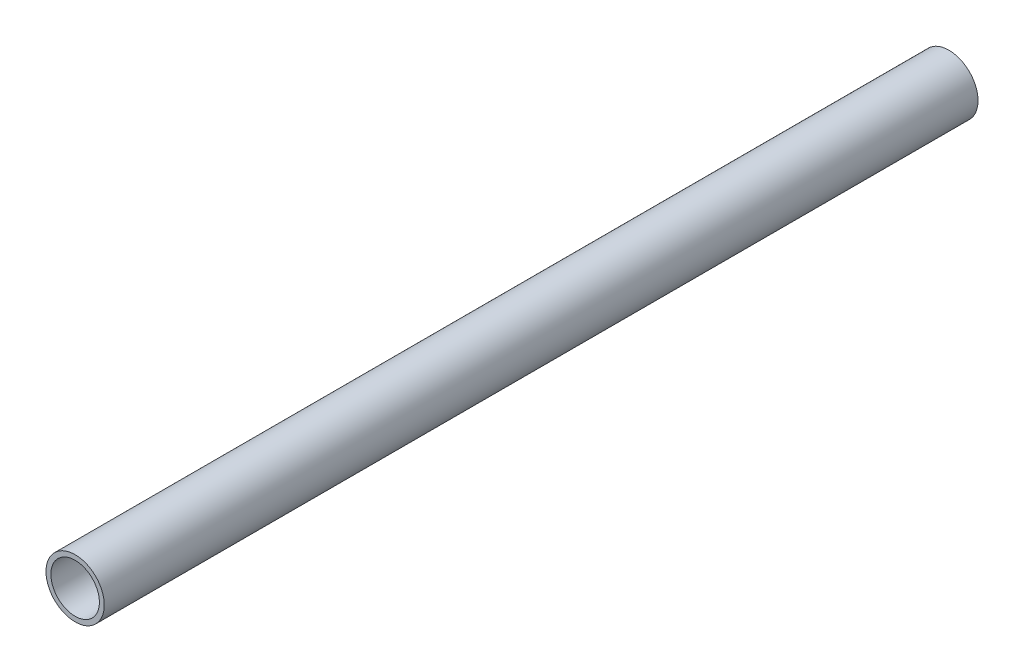
ISO-10303-21;
HEADER;
FILE_DESCRIPTION(('STEP AP214'),'2;1');
FILE_NAME('part.step','',(''),(''),'','','');
FILE_SCHEMA(('AUTOMOTIVE_DESIGN { 1 0 10303 214 1 1 1 1 }'));
ENDSEC;
DATA;
#1=APPLICATION_CONTEXT('core data for automotive mechanical design processes');
#2=APPLICATION_PROTOCOL_DEFINITION('international standard','automotive_design',2000,#1);
#3=PRODUCT_CONTEXT('',#1,'mechanical');
#4=PRODUCT('Part','Part','',(#3));
#5=PRODUCT_RELATED_PRODUCT_CATEGORY('part','',(#4));
#6=PRODUCT_DEFINITION_FORMATION('','',#4);
#7=PRODUCT_DEFINITION_CONTEXT('part definition',#1,'design');
#8=PRODUCT_DEFINITION('design','',#6,#7);
#9=PRODUCT_DEFINITION_SHAPE('','',#8);
#10=(LENGTH_UNIT() NAMED_UNIT(*) SI_UNIT(.MILLI.,.METRE.));
#11=(NAMED_UNIT(*) PLANE_ANGLE_UNIT() SI_UNIT($,.RADIAN.));
#12=(NAMED_UNIT(*) SI_UNIT($,.STERADIAN.) SOLID_ANGLE_UNIT());
#13=UNCERTAINTY_MEASURE_WITH_UNIT(LENGTH_MEASURE(1.E-05),#10,'distance_accuracy_value','');
#14=(GEOMETRIC_REPRESENTATION_CONTEXT(3) GLOBAL_UNCERTAINTY_ASSIGNED_CONTEXT((#13)) GLOBAL_UNIT_ASSIGNED_CONTEXT((#10,
#11,#12)) REPRESENTATION_CONTEXT('',''));
#15=CARTESIAN_POINT('',(0.,0.,0.));
#16=DIRECTION('',(0.,0.,1.));
#17=DIRECTION('',(1.,0.,0.));
#18=AXIS2_PLACEMENT_3D('',#15,#16,#17);
#19=CARTESIAN_POINT('',(0.,0.,90.));
#20=DIRECTION('',(0.,0.,1.));
#21=DIRECTION('',(1.,0.,0.));
#22=AXIS2_PLACEMENT_3D('',#19,#20,#21);
#23=PLANE('',#22);
#24=CARTESIAN_POINT('',(0.,0.,90.));
#25=DIRECTION('',(0.,0.,1.));
#26=DIRECTION('',(1.,0.,0.));
#27=AXIS2_PLACEMENT_3D('',#24,#25,#26);
#28=CIRCLE('',#27,6.);
#29=CARTESIAN_POINT('',(-6.,0.,90.));
#30=VERTEX_POINT('',#29);
#31=EDGE_CURVE('E10',#30,#30,#28,.T.);
#32=ORIENTED_EDGE('',*,*,#31,.T.);
#33=EDGE_LOOP('',(#32));
#34=FACE_BOUND('',#33,.T.);
#35=CARTESIAN_POINT('',(0.,0.,90.));
#36=DIRECTION('',(0.,0.,1.));
#37=DIRECTION('',(1.,0.,0.));
#38=AXIS2_PLACEMENT_3D('',#35,#36,#37);
#39=CIRCLE('',#38,5.);
#40=CARTESIAN_POINT('',(-5.,0.,90.));
#41=VERTEX_POINT('',#40);
#42=EDGE_CURVE('E42',#41,#41,#39,.T.);
#43=ORIENTED_EDGE('',*,*,#42,.F.);
#44=EDGE_LOOP('',(#43));
#45=FACE_BOUND('',#44,.T.);
#46=ADVANCED_FACE('F31',(#34,#45),#23,.T.);
#47=CARTESIAN_POINT('',(0.,0.,-90.));
#48=DIRECTION('',(0.,0.,1.));
#49=DIRECTION('',(1.,0.,0.));
#50=AXIS2_PLACEMENT_3D('',#47,#48,#49);
#51=PLANE('',#50);
#52=CARTESIAN_POINT('',(0.,0.,-90.));
#53=DIRECTION('',(0.,0.,1.));
#54=DIRECTION('',(1.,0.,0.));
#55=AXIS2_PLACEMENT_3D('',#52,#53,#54);
#56=CIRCLE('',#55,6.);
#57=CARTESIAN_POINT('',(-6.,0.,-90.));
#58=VERTEX_POINT('',#57);
#59=EDGE_CURVE('E35',#58,#58,#56,.T.);
#60=ORIENTED_EDGE('',*,*,#59,.F.);
#61=EDGE_LOOP('',(#60));
#62=FACE_BOUND('',#61,.T.);
#63=CARTESIAN_POINT('',(0.,0.,-90.));
#64=DIRECTION('',(0.,0.,1.));
#65=DIRECTION('',(1.,0.,0.));
#66=AXIS2_PLACEMENT_3D('',#63,#64,#65);
#67=CIRCLE('',#66,5.);
#68=CARTESIAN_POINT('',(-5.,0.,-90.));
#69=VERTEX_POINT('',#68);
#70=EDGE_CURVE('E44',#69,#69,#67,.T.);
#71=ORIENTED_EDGE('',*,*,#70,.T.);
#72=EDGE_LOOP('',(#71));
#73=FACE_BOUND('',#72,.T.);
#74=ADVANCED_FACE('F54',(#62,#73),#51,.F.);
#75=CARTESIAN_POINT('',(0.,0.,90.));
#76=DIRECTION('',(0.,0.,-1.));
#77=DIRECTION('',(-1.,0.,0.));
#78=AXIS2_PLACEMENT_3D('',#75,#76,#77);
#79=CYLINDRICAL_SURFACE('',#78,6.);
#80=CARTESIAN_POINT('',(-6.,0.,90.));
#81=CARTESIAN_POINT('',(-6.,0.,88.125));
#82=CARTESIAN_POINT('',(-6.,0.,86.25));
#83=CARTESIAN_POINT('',(-6.,0.,82.5));
#84=CARTESIAN_POINT('',(-6.,0.,80.625));
#85=CARTESIAN_POINT('',(-6.,0.,76.875));
#86=CARTESIAN_POINT('',(-6.,0.,75.));
#87=CARTESIAN_POINT('',(-6.,0.,71.25));
#88=CARTESIAN_POINT('',(-6.,0.,69.375));
#89=CARTESIAN_POINT('',(-6.,0.,65.625));
#90=CARTESIAN_POINT('',(-6.,0.,63.75));
#91=CARTESIAN_POINT('',(-6.,0.,60.));
#92=CARTESIAN_POINT('',(-6.,0.,58.125));
#93=CARTESIAN_POINT('',(-6.,0.,54.375));
#94=CARTESIAN_POINT('',(-6.,0.,52.5));
#95=CARTESIAN_POINT('',(-6.,0.,48.75));
#96=CARTESIAN_POINT('',(-6.,0.,46.875));
#97=CARTESIAN_POINT('',(-6.,0.,43.125));
#98=CARTESIAN_POINT('',(-6.,0.,41.25));
#99=CARTESIAN_POINT('',(-6.,0.,37.5));
#100=CARTESIAN_POINT('',(-6.,0.,35.625));
#101=CARTESIAN_POINT('',(-6.,0.,31.875));
#102=CARTESIAN_POINT('',(-6.,0.,30.));
#103=CARTESIAN_POINT('',(-6.,0.,26.25));
#104=CARTESIAN_POINT('',(-6.,0.,24.375));
#105=CARTESIAN_POINT('',(-6.,0.,20.625));
#106=CARTESIAN_POINT('',(-6.,0.,18.75));
#107=CARTESIAN_POINT('',(-6.,0.,15.));
#108=CARTESIAN_POINT('',(-6.,0.,13.125));
#109=CARTESIAN_POINT('',(-6.,0.,9.37499999999998));
#110=CARTESIAN_POINT('',(-6.,0.,7.49999999999998));
#111=CARTESIAN_POINT('',(-6.,0.,3.74999999999998));
#112=CARTESIAN_POINT('',(-6.,0.,1.87499999999997));
#113=CARTESIAN_POINT('',(-6.,0.,-1.87500000000003));
#114=CARTESIAN_POINT('',(-6.,0.,-3.75000000000003));
#115=CARTESIAN_POINT('',(-6.,0.,-7.50000000000003));
#116=CARTESIAN_POINT('',(-6.,0.,-9.37500000000004));
#117=CARTESIAN_POINT('',(-6.,0.,-13.125));
#118=CARTESIAN_POINT('',(-6.,0.,-15.));
#119=CARTESIAN_POINT('',(-6.,0.,-18.75));
#120=CARTESIAN_POINT('',(-6.,0.,-20.625));
#121=CARTESIAN_POINT('',(-6.,0.,-24.375));
#122=CARTESIAN_POINT('',(-6.,0.,-26.25));
#123=CARTESIAN_POINT('',(-6.,0.,-30.));
#124=CARTESIAN_POINT('',(-6.,0.,-31.875));
#125=CARTESIAN_POINT('',(-6.,0.,-35.625));
#126=CARTESIAN_POINT('',(-6.,0.,-37.5));
#127=CARTESIAN_POINT('',(-6.,0.,-41.25));
#128=CARTESIAN_POINT('',(-6.,0.,-43.125));
#129=CARTESIAN_POINT('',(-6.,0.,-46.875));
#130=CARTESIAN_POINT('',(-6.,0.,-48.75));
#131=CARTESIAN_POINT('',(-6.,0.,-52.5));
#132=CARTESIAN_POINT('',(-6.,0.,-54.375));
#133=CARTESIAN_POINT('',(-6.,0.,-58.125));
#134=CARTESIAN_POINT('',(-6.,0.,-60.));
#135=CARTESIAN_POINT('',(-6.,0.,-63.75));
#136=CARTESIAN_POINT('',(-6.,0.,-65.625));
#137=CARTESIAN_POINT('',(-6.,0.,-69.375));
#138=CARTESIAN_POINT('',(-6.,0.,-71.25));
#139=CARTESIAN_POINT('',(-6.,0.,-75.));
#140=CARTESIAN_POINT('',(-6.,0.,-76.875));
#141=CARTESIAN_POINT('',(-6.,0.,-80.625));
#142=CARTESIAN_POINT('',(-6.,0.,-82.5));
#143=CARTESIAN_POINT('',(-6.,0.,-86.25));
#144=CARTESIAN_POINT('',(-6.,0.,-88.125));
#145=CARTESIAN_POINT('',(-6.,0.,-90.));
#146=B_SPLINE_CURVE_WITH_KNOTS('',3,(#80,#81,#82,#83,#84,#85,#86,#87,#88,#89,#90,#91,#92,#93,
#94,#95,#96,#97,#98,#99,#100,#101,#102,#103,#104,#105,#106,#107,#108,#109,#110,#111,#112,#113,
#114,#115,#116,#117,#118,#119,#120,#121,#122,#123,#124,#125,#126,#127,#128,#129,#130,#131,#132,
#133,#134,#135,#136,#137,#138,#139,#140,#141,#142,#143,#144,#145),.UNSPECIFIED.,.F.,.F.,(4,2,2,
2,2,2,2,2,2,2,2,2,2,2,2,2,2,2,2,2,2,2,2,2,2,2,2,2,2,2,2,2,4),(0.,5.62499999999999,11.25,16.875,
22.5,28.125,33.75,39.375,45.,50.625,56.25,61.875,67.5,73.125,78.75,84.375,90.,95.625,101.25,
106.875,112.5,118.125,123.75,129.375,135.,140.625,146.25,151.875,157.5,163.125,168.75,174.375,
180.),.UNSPECIFIED.);
#147=EDGE_CURVE('BSEAM33',#30,#58,#146,.T.);
#148=ORIENTED_EDGE('',*,*,#31,.F.);
#149=ORIENTED_EDGE('',*,*,#59,.T.);
#150=ORIENTED_EDGE('',*,*,#147,.T.);
#151=ORIENTED_EDGE('',*,*,#147,.F.);
#152=EDGE_LOOP('',(#148,#150,#149,#151));
#153=FACE_BOUND('',#152,.T.);
#154=ADVANCED_FACE('F33',(#153),#79,.T.);
#155=CARTESIAN_POINT('',(0.,0.,90.));
#156=DIRECTION('',(0.,0.,-1.));
#157=DIRECTION('',(-1.,0.,0.));
#158=AXIS2_PLACEMENT_3D('',#155,#156,#157);
#159=CYLINDRICAL_SURFACE('',#158,5.);
#160=CARTESIAN_POINT('',(-5.,0.,90.));
#161=CARTESIAN_POINT('',(-5.,0.,88.125));
#162=CARTESIAN_POINT('',(-5.,0.,86.25));
#163=CARTESIAN_POINT('',(-5.,0.,82.5));
#164=CARTESIAN_POINT('',(-5.,0.,80.625));
#165=CARTESIAN_POINT('',(-5.,0.,76.875));
#166=CARTESIAN_POINT('',(-5.,0.,75.));
#167=CARTESIAN_POINT('',(-5.,0.,71.25));
#168=CARTESIAN_POINT('',(-5.,0.,69.375));
#169=CARTESIAN_POINT('',(-5.,0.,65.625));
#170=CARTESIAN_POINT('',(-5.,0.,63.75));
#171=CARTESIAN_POINT('',(-5.,0.,60.));
#172=CARTESIAN_POINT('',(-5.,0.,58.125));
#173=CARTESIAN_POINT('',(-5.,0.,54.375));
#174=CARTESIAN_POINT('',(-5.,0.,52.5));
#175=CARTESIAN_POINT('',(-5.,0.,48.75));
#176=CARTESIAN_POINT('',(-5.,0.,46.875));
#177=CARTESIAN_POINT('',(-5.,0.,43.125));
#178=CARTESIAN_POINT('',(-5.,0.,41.25));
#179=CARTESIAN_POINT('',(-5.,0.,37.5));
#180=CARTESIAN_POINT('',(-5.,0.,35.625));
#181=CARTESIAN_POINT('',(-5.,0.,31.875));
#182=CARTESIAN_POINT('',(-5.,0.,30.));
#183=CARTESIAN_POINT('',(-5.,0.,26.25));
#184=CARTESIAN_POINT('',(-5.,0.,24.375));
#185=CARTESIAN_POINT('',(-5.,0.,20.625));
#186=CARTESIAN_POINT('',(-5.,0.,18.75));
#187=CARTESIAN_POINT('',(-5.,0.,15.));
#188=CARTESIAN_POINT('',(-5.,0.,13.125));
#189=CARTESIAN_POINT('',(-5.,0.,9.37499999999999));
#190=CARTESIAN_POINT('',(-5.,0.,7.49999999999999));
#191=CARTESIAN_POINT('',(-5.,0.,3.74999999999999));
#192=CARTESIAN_POINT('',(-5.,0.,1.87499999999999));
#193=CARTESIAN_POINT('',(-5.,0.,-1.87500000000002));
#194=CARTESIAN_POINT('',(-5.,0.,-3.75000000000002));
#195=CARTESIAN_POINT('',(-5.,0.,-7.50000000000002));
#196=CARTESIAN_POINT('',(-5.,0.,-9.37500000000002));
#197=CARTESIAN_POINT('',(-5.,0.,-13.125));
#198=CARTESIAN_POINT('',(-5.,0.,-15.));
#199=CARTESIAN_POINT('',(-5.,0.,-18.75));
#200=CARTESIAN_POINT('',(-5.,0.,-20.625));
#201=CARTESIAN_POINT('',(-5.,0.,-24.375));
#202=CARTESIAN_POINT('',(-5.,0.,-26.25));
#203=CARTESIAN_POINT('',(-5.,0.,-30.));
#204=CARTESIAN_POINT('',(-5.,0.,-31.875));
#205=CARTESIAN_POINT('',(-5.,0.,-35.625));
#206=CARTESIAN_POINT('',(-5.,0.,-37.5));
#207=CARTESIAN_POINT('',(-5.,0.,-41.25));
#208=CARTESIAN_POINT('',(-5.,0.,-43.125));
#209=CARTESIAN_POINT('',(-5.,0.,-46.875));
#210=CARTESIAN_POINT('',(-5.,0.,-48.75));
#211=CARTESIAN_POINT('',(-5.,0.,-52.5));
#212=CARTESIAN_POINT('',(-5.,0.,-54.375));
#213=CARTESIAN_POINT('',(-5.,0.,-58.125));
#214=CARTESIAN_POINT('',(-5.,0.,-60.));
#215=CARTESIAN_POINT('',(-5.,0.,-63.75));
#216=CARTESIAN_POINT('',(-5.,0.,-65.625));
#217=CARTESIAN_POINT('',(-5.,0.,-69.375));
#218=CARTESIAN_POINT('',(-5.,0.,-71.25));
#219=CARTESIAN_POINT('',(-5.,0.,-75.));
#220=CARTESIAN_POINT('',(-5.,0.,-76.875));
#221=CARTESIAN_POINT('',(-5.,0.,-80.625));
#222=CARTESIAN_POINT('',(-5.,0.,-82.5));
#223=CARTESIAN_POINT('',(-5.,0.,-86.25));
#224=CARTESIAN_POINT('',(-5.,0.,-88.125));
#225=CARTESIAN_POINT('',(-5.,0.,-90.));
#226=B_SPLINE_CURVE_WITH_KNOTS('',3,(#160,#161,#162,#163,#164,#165,#166,#167,#168,#169,#170,
#171,#172,#173,#174,#175,#176,#177,#178,#179,#180,#181,#182,#183,#184,#185,#186,#187,#188,#189,
#190,#191,#192,#193,#194,#195,#196,#197,#198,#199,#200,#201,#202,#203,#204,#205,#206,#207,#208,
#209,#210,#211,#212,#213,#214,#215,#216,#217,#218,#219,#220,#221,#222,#223,#224,#225),
.UNSPECIFIED.,.F.,.F.,(4,2,2,2,2,2,2,2,2,2,2,2,2,2,2,2,2,2,2,2,2,2,2,2,2,2,2,2,2,2,2,2,4),(0.,
5.62500000000001,11.25,16.875,22.5,28.125,33.75,39.375,45.,50.625,56.25,61.875,67.5,73.125,
78.75,84.375,90.,95.625,101.25,106.875,112.5,118.125,123.75,129.375,135.,140.625,146.25,151.875,
157.5,163.125,168.75,174.375,180.),.UNSPECIFIED.);
#227=EDGE_CURVE('BSEAM50',#41,#69,#226,.T.);
#228=ORIENTED_EDGE('',*,*,#42,.T.);
#229=ORIENTED_EDGE('',*,*,#70,.F.);
#230=ORIENTED_EDGE('',*,*,#227,.T.);
#231=ORIENTED_EDGE('',*,*,#227,.F.);
#232=EDGE_LOOP('',(#228,#230,#229,#231));
#233=FACE_BOUND('',#232,.T.);
#234=ADVANCED_FACE('F50',(#233),#159,.F.);
#235=CLOSED_SHELL('',(#46,#74,#154,#234));
#236=MANIFOLD_SOLID_BREP('B2',#235);
#237=ADVANCED_BREP_SHAPE_REPRESENTATION('',(#18,#236),#14);
#238=SHAPE_DEFINITION_REPRESENTATION(#9,#237);
ENDSEC;
END-ISO-10303-21;
